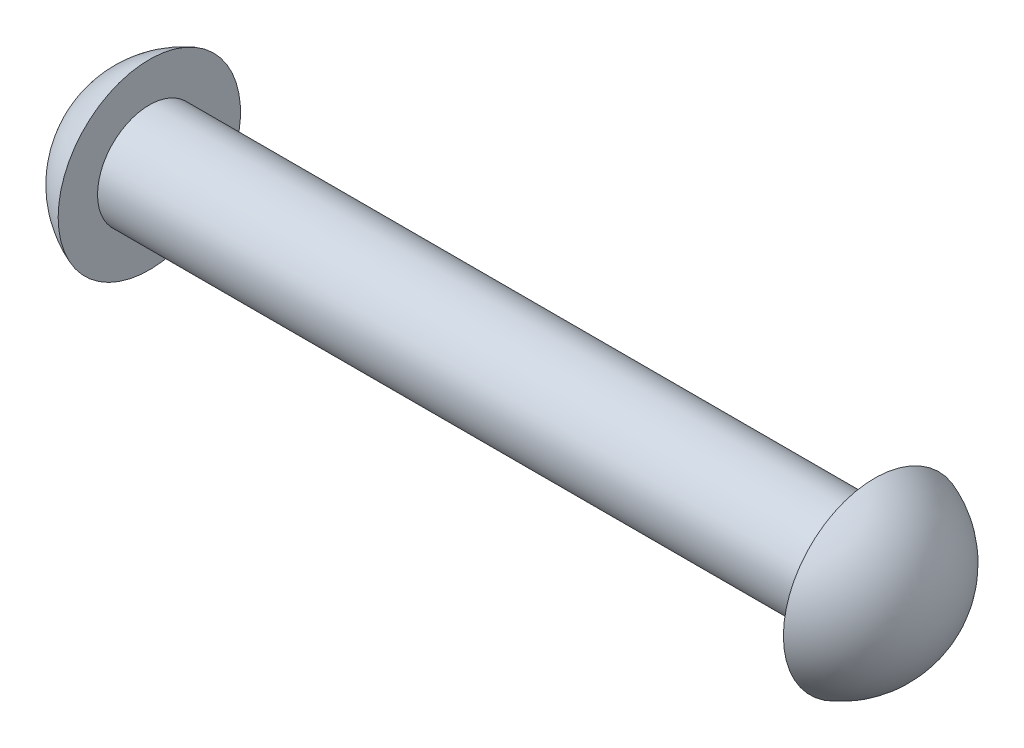
ISO-10303-21;
HEADER;
FILE_DESCRIPTION(('STEP AP214'),'2;1');
FILE_NAME('part.step','',(''),(''),'','','');
FILE_SCHEMA(('AUTOMOTIVE_DESIGN { 1 0 10303 214 1 1 1 1 }'));
ENDSEC;
DATA;
#1=APPLICATION_CONTEXT('core data for automotive mechanical design processes');
#2=APPLICATION_PROTOCOL_DEFINITION('international standard','automotive_design',2000,#1);
#3=PRODUCT_CONTEXT('',#1,'mechanical');
#4=PRODUCT('Part','Part','',(#3));
#5=PRODUCT_RELATED_PRODUCT_CATEGORY('part','',(#4));
#6=PRODUCT_DEFINITION_FORMATION('','',#4);
#7=PRODUCT_DEFINITION_CONTEXT('part definition',#1,'design');
#8=PRODUCT_DEFINITION('design','',#6,#7);
#9=PRODUCT_DEFINITION_SHAPE('','',#8);
#10=(LENGTH_UNIT() NAMED_UNIT(*) SI_UNIT(.MILLI.,.METRE.));
#11=(NAMED_UNIT(*) PLANE_ANGLE_UNIT() SI_UNIT($,.RADIAN.));
#12=(NAMED_UNIT(*) SI_UNIT($,.STERADIAN.) SOLID_ANGLE_UNIT());
#13=UNCERTAINTY_MEASURE_WITH_UNIT(LENGTH_MEASURE(1.E-05),#10,'distance_accuracy_value','');
#14=(GEOMETRIC_REPRESENTATION_CONTEXT(3) GLOBAL_UNCERTAINTY_ASSIGNED_CONTEXT((#13)) GLOBAL_UNIT_ASSIGNED_CONTEXT((#10,
#11,#12)) REPRESENTATION_CONTEXT('',''));
#15=CARTESIAN_POINT('',(0.,0.,0.));
#16=DIRECTION('',(0.,0.,1.));
#17=DIRECTION('',(1.,0.,0.));
#18=AXIS2_PLACEMENT_3D('',#15,#16,#17);
#19=CARTESIAN_POINT('',(-39.,0.,0.));
#20=DIRECTION('',(-1.,0.,0.));
#21=DIRECTION('',(0.,0.,1.));
#22=AXIS2_PLACEMENT_3D('',#19,#20,#21);
#23=CYLINDRICAL_SURFACE('',#22,2.5);
#24=CARTESIAN_POINT('',(-35.,0.,0.));
#25=DIRECTION('',(-1.,0.,0.));
#26=DIRECTION('',(0.,0.,1.));
#27=AXIS2_PLACEMENT_3D('',#24,#25,#26);
#28=CIRCLE('',#27,2.5);
#29=CARTESIAN_POINT('',(-35.,0.,2.5));
#30=VERTEX_POINT('',#29);
#31=EDGE_CURVE('E11',#30,#30,#28,.T.);
#32=ORIENTED_EDGE('',*,*,#31,.F.);
#33=EDGE_LOOP('',(#32));
#34=FACE_BOUND('',#33,.T.);
#35=CARTESIAN_POINT('',(0.,0.,0.));
#36=DIRECTION('',(1.,0.,0.));
#37=DIRECTION('',(0.,0.,-1.));
#38=AXIS2_PLACEMENT_3D('',#35,#36,#37);
#39=CIRCLE('',#38,2.5);
#40=CARTESIAN_POINT('',(0.,0.,-2.5));
#41=VERTEX_POINT('',#40);
#42=EDGE_CURVE('E68',#41,#41,#39,.T.);
#43=ORIENTED_EDGE('',*,*,#42,.F.);
#44=EDGE_LOOP('',(#43));
#45=FACE_BOUND('',#44,.T.);
#46=ADVANCED_FACE('F32',(#34,#45),#23,.T.);
#47=CARTESIAN_POINT('',(-35.,2.5,0.));
#48=DIRECTION('',(-1.,0.,0.));
#49=DIRECTION('',(0.,0.,1.));
#50=AXIS2_PLACEMENT_3D('',#47,#48,#49);
#51=PLANE('',#50);
#52=CARTESIAN_POINT('',(-35.,0.,0.));
#53=DIRECTION('',(-1.,0.,0.));
#54=DIRECTION('',(0.,0.,1.));
#55=AXIS2_PLACEMENT_3D('',#52,#53,#54);
#56=CIRCLE('',#55,4.4);
#57=CARTESIAN_POINT('',(-35.,0.,4.4));
#58=VERTEX_POINT('',#57);
#59=EDGE_CURVE('E39',#58,#58,#56,.T.);
#60=ORIENTED_EDGE('',*,*,#59,.F.);
#61=EDGE_LOOP('',(#60));
#62=FACE_BOUND('',#61,.T.);
#63=ORIENTED_EDGE('',*,*,#31,.T.);
#64=EDGE_LOOP('',(#63));
#65=FACE_BOUND('',#64,.T.);
#66=ADVANCED_FACE('F58',(#62,#65),#51,.F.);
#67=CARTESIAN_POINT('',(-33.4008213472632,0.,0.0869236458612499));
#68=DIRECTION('',(0.,-1.,0.));
#69=DIRECTION('',(0.,0.,1.));
#70=AXIS2_PLACEMENT_3D('',#67,#68,#69);
#71=CIRCLE('',#70,4.6);
#72=TRIMMED_CURVE('',#71,(PARAMETER_VALUE(-1.58969389630472)),
(PARAMETER_VALUE(1.58969389630472)),.T.,.PARAMETER.);
#73=CARTESIAN_POINT('',(-33.4008213472632,0.,0.));
#74=DIRECTION('',(-1.,0.,0.));
#75=AXIS1_PLACEMENT('',#73,#74);
#76=SURFACE_OF_REVOLUTION('',#72,#75);
#77=CARTESIAN_POINT('',(-38.,0.,0.));
#78=VERTEX_POINT('',#77);
#79=VERTEX_LOOP('',#78);
#80=FACE_BOUND('',#79,.T.);
#81=ORIENTED_EDGE('',*,*,#59,.T.);
#82=EDGE_LOOP('',(#81));
#83=FACE_BOUND('',#82,.T.);
#84=ADVANCED_FACE('F53',(#80,#83),#76,.T.);
#85=CARTESIAN_POINT('',(0.,0.,0.));
#86=DIRECTION('',(1.,0.,0.));
#87=DIRECTION('',(0.,0.,-1.));
#88=AXIS2_PLACEMENT_3D('',#85,#86,#87);
#89=PLANE('',#88);
#90=ORIENTED_EDGE('',*,*,#42,.T.);
#91=EDGE_LOOP('',(#90));
#92=FACE_BOUND('',#91,.T.);
#93=CARTESIAN_POINT('',(0.,0.,0.));
#94=DIRECTION('',(-1.,0.,0.));
#95=DIRECTION('',(0.,0.,1.));
#96=AXIS2_PLACEMENT_3D('',#93,#94,#95);
#97=CIRCLE('',#96,4.4);
#98=CARTESIAN_POINT('',(0.,0.,4.4));
#99=VERTEX_POINT('',#98);
#100=EDGE_CURVE('E69',#99,#99,#97,.T.);
#101=ORIENTED_EDGE('',*,*,#100,.T.);
#102=EDGE_LOOP('',(#101));
#103=FACE_BOUND('',#102,.T.);
#104=ADVANCED_FACE('F47',(#92,#103),#89,.F.);
#105=CARTESIAN_POINT('',(-1.59917865273683,0.,0.0869236458612508));
#106=DIRECTION('',(0.,-1.,0.));
#107=DIRECTION('',(0.,0.,1.));
#108=AXIS2_PLACEMENT_3D('',#105,#106,#107);
#109=CIRCLE('',#108,4.6);
#110=TRIMMED_CURVE('',#109,(PARAMETER_VALUE(-1.58969389630472)),
(PARAMETER_VALUE(1.58969389630472)),.T.,.PARAMETER.);
#111=CARTESIAN_POINT('',(-1.59917865273683,0.,0.));
#112=DIRECTION('',(-1.,0.,0.));
#113=AXIS1_PLACEMENT('',#111,#112);
#114=SURFACE_OF_REVOLUTION('',#110,#113);
#115=ORIENTED_EDGE('',*,*,#100,.F.);
#116=EDGE_LOOP('',(#115));
#117=FACE_BOUND('',#116,.T.);
#118=CARTESIAN_POINT('',(3.,0.,0.));
#119=VERTEX_POINT('',#118);
#120=VERTEX_LOOP('',#119);
#121=FACE_BOUND('',#120,.T.);
#122=ADVANCED_FACE('F45',(#117,#121),#114,.T.);
#123=CLOSED_SHELL('',(#46,#66,#84,#104,#122));
#124=MANIFOLD_SOLID_BREP('B2',#123);
#125=ADVANCED_BREP_SHAPE_REPRESENTATION('',(#18,#124),#14);
#126=SHAPE_DEFINITION_REPRESENTATION(#9,#125);
ENDSEC;
END-ISO-10303-21;
